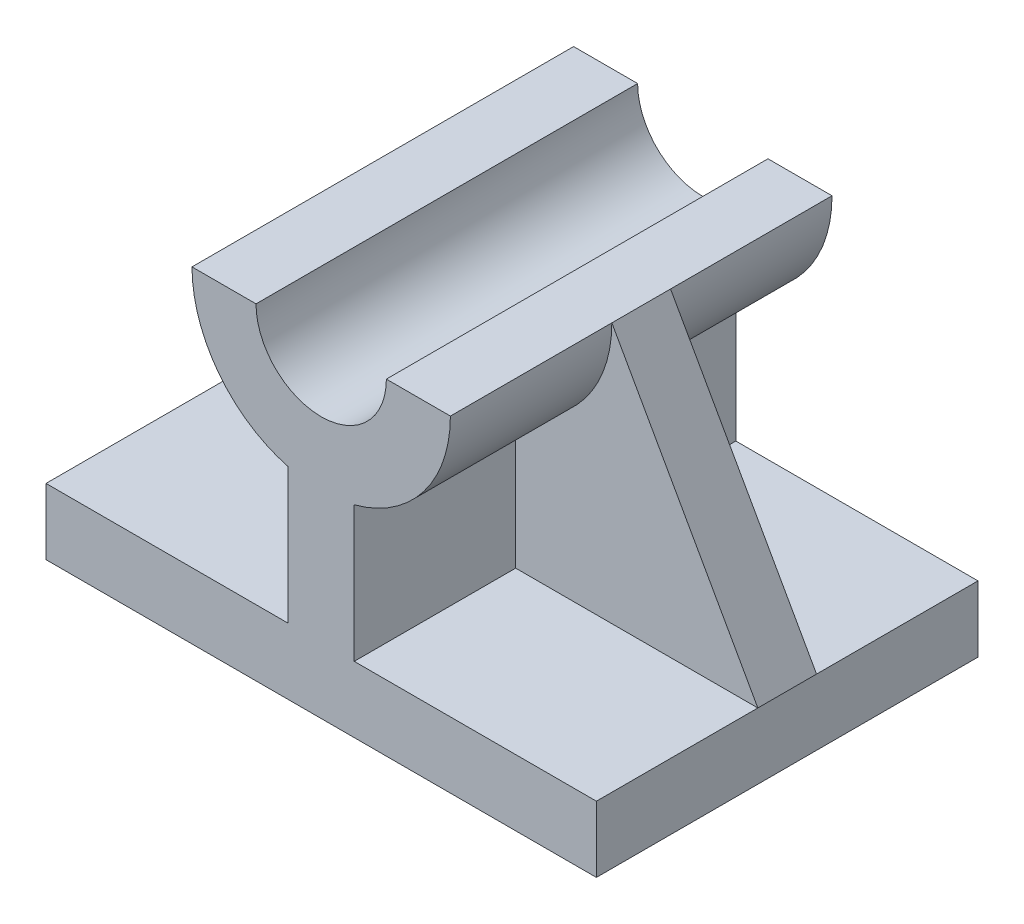
ISO-10303-21;
HEADER;
FILE_DESCRIPTION(('STEP AP214'),'2;1');
FILE_NAME('part.step','',(''),(''),'','','');
FILE_SCHEMA(('AUTOMOTIVE_DESIGN { 1 0 10303 214 1 1 1 1 }'));
ENDSEC;
DATA;
#1=APPLICATION_CONTEXT('core data for automotive mechanical design processes');
#2=APPLICATION_PROTOCOL_DEFINITION('international standard','automotive_design',2000,#1);
#3=PRODUCT_CONTEXT('',#1,'mechanical');
#4=PRODUCT('Part','Part','',(#3));
#5=PRODUCT_RELATED_PRODUCT_CATEGORY('part','',(#4));
#6=PRODUCT_DEFINITION_FORMATION('','',#4);
#7=PRODUCT_DEFINITION_CONTEXT('part definition',#1,'design');
#8=PRODUCT_DEFINITION('design','',#6,#7);
#9=PRODUCT_DEFINITION_SHAPE('','',#8);
#10=(LENGTH_UNIT() NAMED_UNIT(*) SI_UNIT(.MILLI.,.METRE.));
#11=(NAMED_UNIT(*) PLANE_ANGLE_UNIT() SI_UNIT($,.RADIAN.));
#12=(NAMED_UNIT(*) SI_UNIT($,.STERADIAN.) SOLID_ANGLE_UNIT());
#13=UNCERTAINTY_MEASURE_WITH_UNIT(LENGTH_MEASURE(1.E-05),#10,'distance_accuracy_value','');
#14=(GEOMETRIC_REPRESENTATION_CONTEXT(3) GLOBAL_UNCERTAINTY_ASSIGNED_CONTEXT((#13)) GLOBAL_UNIT_ASSIGNED_CONTEXT((#10,
#11,#12)) REPRESENTATION_CONTEXT('',''));
#15=CARTESIAN_POINT('',(0.,0.,0.));
#16=DIRECTION('',(0.,0.,1.));
#17=DIRECTION('',(1.,0.,0.));
#18=AXIS2_PLACEMENT_3D('',#15,#16,#17);
#19=CARTESIAN_POINT('',(0.,40.,-26.));
#20=DIRECTION('',(0.,0.,1.));
#21=DIRECTION('',(1.,0.,0.));
#22=AXIS2_PLACEMENT_3D('',#19,#20,#21);
#23=CYLINDRICAL_SURFACE('',#22,17.6059098801234);
#24=DIRECTION('',(0.,0.,1.));
#25=VECTOR('',#24,1.);
#26=CARTESIAN_POINT('',(17.6059098801234,40.,-26.));
#27=LINE('',#26,#25);
#28=CARTESIAN_POINT('',(17.6059098801234,40.,-26.));
#29=VERTEX_POINT('',#28);
#30=CARTESIAN_POINT('',(17.6059098801234,40.,-4.));
#31=VERTEX_POINT('',#30);
#32=EDGE_CURVE('E168',#29,#31,#27,.T.);
#33=ORIENTED_EDGE('',*,*,#32,.T.);
#34=CARTESIAN_POINT('',(0.,40.,-4.));
#35=DIRECTION('',(0.,0.,1.));
#36=DIRECTION('',(1.,0.,0.));
#37=AXIS2_PLACEMENT_3D('',#34,#35,#36);
#38=CIRCLE('',#37,17.6059098801234);
#39=CARTESIAN_POINT('',(4.5,22.9788936109598,-4.));
#40=VERTEX_POINT('',#39);
#41=EDGE_CURVE('E144',#31,#40,#38,.F.);
#42=ORIENTED_EDGE('',*,*,#41,.T.);
#43=DIRECTION('',(0.,0.,1.));
#44=VECTOR('',#43,1.);
#45=CARTESIAN_POINT('',(4.49999999999999,22.9788936109598,-26.));
#46=LINE('',#45,#44);
#47=CARTESIAN_POINT('',(4.49999999999999,22.9788936109598,-26.));
#48=VERTEX_POINT('',#47);
#49=EDGE_CURVE('E182',#48,#40,#46,.T.);
#50=ORIENTED_EDGE('',*,*,#49,.F.);
#51=CARTESIAN_POINT('',(0.,40.,-26.));
#52=DIRECTION('',(0.,0.,1.));
#53=DIRECTION('',(1.,0.,0.));
#54=AXIS2_PLACEMENT_3D('',#51,#52,#53);
#55=CIRCLE('',#54,17.6059098801234);
#56=EDGE_CURVE('E177',#48,#29,#55,.T.);
#57=ORIENTED_EDGE('',*,*,#56,.T.);
#58=EDGE_LOOP('',(#33,#42,#50,#57));
#59=FACE_BOUND('',#58,.T.);
#60=ADVANCED_FACE('F33',(#59),#23,.T.);
#61=CARTESIAN_POINT('',(4.5,22.9788936109598,-26.));
#62=DIRECTION('',(1.,0.,0.));
#63=DIRECTION('',(0.,0.,-1.));
#64=AXIS2_PLACEMENT_3D('',#61,#62,#63);
#65=PLANE('',#64);
#66=ORIENTED_EDGE('',*,*,#49,.T.);
#67=DIRECTION('',(0.,-1.,0.));
#68=VECTOR('',#67,1.);
#69=CARTESIAN_POINT('',(4.5,22.9788936109598,-4.));
#70=LINE('',#69,#68);
#71=CARTESIAN_POINT('',(4.5,4.5,-4.));
#72=VERTEX_POINT('',#71);
#73=EDGE_CURVE('E147',#40,#72,#70,.T.);
#74=ORIENTED_EDGE('',*,*,#73,.T.);
#75=DIRECTION('',(0.,0.,1.));
#76=VECTOR('',#75,1.);
#77=CARTESIAN_POINT('',(4.5,4.5,-26.));
#78=LINE('',#77,#76);
#79=CARTESIAN_POINT('',(4.5,4.5,-26.));
#80=VERTEX_POINT('',#79);
#81=EDGE_CURVE('E187',#80,#72,#78,.T.);
#82=ORIENTED_EDGE('',*,*,#81,.F.);
#83=DIRECTION('',(0.,1.,0.));
#84=VECTOR('',#83,1.);
#85=CARTESIAN_POINT('',(4.5,22.9788936109598,-26.));
#86=LINE('',#85,#84);
#87=EDGE_CURVE('E258',#80,#48,#86,.T.);
#88=ORIENTED_EDGE('',*,*,#87,.T.);
#89=EDGE_LOOP('',(#66,#74,#82,#88));
#90=FACE_BOUND('',#89,.T.);
#91=ADVANCED_FACE('F288',(#90),#65,.T.);
#92=CARTESIAN_POINT('',(4.5,4.5,-26.));
#93=DIRECTION('',(0.,1.,0.));
#94=DIRECTION('',(-1.,0.,0.));
#95=AXIS2_PLACEMENT_3D('',#92,#93,#94);
#96=PLANE('',#95);
#97=ORIENTED_EDGE('',*,*,#81,.T.);
#98=DIRECTION('',(1.,0.,0.));
#99=VECTOR('',#98,1.);
#100=CARTESIAN_POINT('',(4.5,4.5,-4.));
#101=LINE('',#100,#99);
#102=CARTESIAN_POINT('',(37.5,4.5,-4.00000000000001));
#103=VERTEX_POINT('',#102);
#104=EDGE_CURVE('E41',#72,#103,#101,.T.);
#105=ORIENTED_EDGE('',*,*,#104,.T.);
#106=DIRECTION('',(0.,0.,1.));
#107=VECTOR('',#106,1.);
#108=CARTESIAN_POINT('',(37.5,4.5,-26.));
#109=LINE('',#108,#107);
#110=CARTESIAN_POINT('',(37.5,4.5,-26.));
#111=VERTEX_POINT('',#110);
#112=EDGE_CURVE('E191',#111,#103,#109,.T.);
#113=ORIENTED_EDGE('',*,*,#112,.F.);
#114=DIRECTION('',(-1.,0.,0.));
#115=VECTOR('',#114,1.);
#116=CARTESIAN_POINT('',(4.5,4.5,-26.));
#117=LINE('',#116,#115);
#118=EDGE_CURVE('E255',#111,#80,#117,.T.);
#119=ORIENTED_EDGE('',*,*,#118,.T.);
#120=EDGE_LOOP('',(#97,#105,#113,#119));
#121=FACE_BOUND('',#120,.T.);
#122=ADVANCED_FACE('F283',(#121),#96,.T.);
#123=CARTESIAN_POINT('',(37.5,4.5,-26.));
#124=DIRECTION('',(1.,0.,0.));
#125=DIRECTION('',(0.,0.,-1.));
#126=AXIS2_PLACEMENT_3D('',#123,#124,#125);
#127=PLANE('',#126);
#128=DIRECTION('',(0.,1.,0.));
#129=VECTOR('',#128,1.);
#130=CARTESIAN_POINT('',(37.5,4.5,26.));
#131=LINE('',#130,#129);
#132=CARTESIAN_POINT('',(37.5,-4.5,26.));
#133=VERTEX_POINT('',#132);
#134=CARTESIAN_POINT('',(37.5,4.5,26.));
#135=VERTEX_POINT('',#134);
#136=EDGE_CURVE('E172',#133,#135,#131,.T.);
#137=ORIENTED_EDGE('',*,*,#136,.F.);
#138=DIRECTION('',(0.,0.,1.));
#139=VECTOR('',#138,1.);
#140=CARTESIAN_POINT('',(37.5,-4.5,-26.));
#141=LINE('',#140,#139);
#142=CARTESIAN_POINT('',(37.5,-4.5,-26.));
#143=VERTEX_POINT('',#142);
#144=EDGE_CURVE('E56',#143,#133,#141,.T.);
#145=ORIENTED_EDGE('',*,*,#144,.F.);
#146=DIRECTION('',(0.,1.,0.));
#147=VECTOR('',#146,1.);
#148=CARTESIAN_POINT('',(37.5,4.5,-26.));
#149=LINE('',#148,#147);
#150=EDGE_CURVE('E253',#143,#111,#149,.T.);
#151=ORIENTED_EDGE('',*,*,#150,.T.);
#152=ORIENTED_EDGE('',*,*,#112,.T.);
#153=CARTESIAN_POINT('',(37.5,4.5,4.));
#154=VERTEX_POINT('',#153);
#155=EDGE_CURVE('E160',#103,#154,#109,.T.);
#156=ORIENTED_EDGE('',*,*,#155,.T.);
#157=EDGE_CURVE('E193',#154,#135,#109,.T.);
#158=ORIENTED_EDGE('',*,*,#157,.T.);
#159=EDGE_LOOP('',(#137,#145,#151,#152,#156,#158));
#160=FACE_BOUND('',#159,.T.);
#161=ADVANCED_FACE('F35',(#160),#127,.T.);
#162=CARTESIAN_POINT('',(-37.5,-4.5,-26.));
#163=DIRECTION('',(0.,-1.,0.));
#164=DIRECTION('',(0.,0.,-1.));
#165=AXIS2_PLACEMENT_3D('',#162,#163,#164);
#166=PLANE('',#165);
#167=DIRECTION('',(1.,0.,0.));
#168=VECTOR('',#167,1.);
#169=CARTESIAN_POINT('',(-37.5,-4.5,26.));
#170=LINE('',#169,#168);
#171=CARTESIAN_POINT('',(-37.5,-4.5,26.));
#172=VERTEX_POINT('',#171);
#173=EDGE_CURVE('E251',#172,#133,#170,.T.);
#174=ORIENTED_EDGE('',*,*,#173,.F.);
#175=DIRECTION('',(0.,0.,1.));
#176=VECTOR('',#175,1.);
#177=CARTESIAN_POINT('',(-37.5,-4.5,-26.));
#178=LINE('',#177,#176);
#179=CARTESIAN_POINT('',(-37.5,-4.5,-26.));
#180=VERTEX_POINT('',#179);
#181=EDGE_CURVE('E195',#180,#172,#178,.T.);
#182=ORIENTED_EDGE('',*,*,#181,.F.);
#183=DIRECTION('',(1.,0.,0.));
#184=VECTOR('',#183,1.);
#185=CARTESIAN_POINT('',(-37.5,-4.5,-26.));
#186=LINE('',#185,#184);
#187=EDGE_CURVE('E204',#180,#143,#186,.T.);
#188=ORIENTED_EDGE('',*,*,#187,.T.);
#189=ORIENTED_EDGE('',*,*,#144,.T.);
#190=EDGE_LOOP('',(#174,#182,#188,#189));
#191=FACE_BOUND('',#190,.T.);
#192=ADVANCED_FACE('F319',(#191),#166,.T.);
#193=CARTESIAN_POINT('',(-37.5,4.5,-26.));
#194=DIRECTION('',(-1.,0.,0.));
#195=DIRECTION('',(0.,0.,1.));
#196=AXIS2_PLACEMENT_3D('',#193,#194,#195);
#197=PLANE('',#196);
#198=DIRECTION('',(0.,-1.,0.));
#199=VECTOR('',#198,1.);
#200=CARTESIAN_POINT('',(-37.5,4.5,26.));
#201=LINE('',#200,#199);
#202=CARTESIAN_POINT('',(-37.5,4.5,26.));
#203=VERTEX_POINT('',#202);
#204=EDGE_CURVE('E248',#203,#172,#201,.T.);
#205=ORIENTED_EDGE('',*,*,#204,.F.);
#206=DIRECTION('',(0.,0.,1.));
#207=VECTOR('',#206,1.);
#208=CARTESIAN_POINT('',(-37.5,4.5,-26.));
#209=LINE('',#208,#207);
#210=CARTESIAN_POINT('',(-37.5,4.5,-26.));
#211=VERTEX_POINT('',#210);
#212=EDGE_CURVE('E201',#211,#203,#209,.T.);
#213=ORIENTED_EDGE('',*,*,#212,.F.);
#214=DIRECTION('',(0.,-1.,0.));
#215=VECTOR('',#214,1.);
#216=CARTESIAN_POINT('',(-37.5,4.5,-26.));
#217=LINE('',#216,#215);
#218=EDGE_CURVE('E275',#211,#180,#217,.T.);
#219=ORIENTED_EDGE('',*,*,#218,.T.);
#220=ORIENTED_EDGE('',*,*,#181,.T.);
#221=EDGE_LOOP('',(#205,#213,#219,#220));
#222=FACE_BOUND('',#221,.T.);
#223=ADVANCED_FACE('F318',(#222),#197,.T.);
#224=CARTESIAN_POINT('',(-37.5,4.5,-26.));
#225=DIRECTION('',(0.,1.,0.));
#226=DIRECTION('',(-1.,0.,0.));
#227=AXIS2_PLACEMENT_3D('',#224,#225,#226);
#228=PLANE('',#227);
#229=DIRECTION('',(-1.,0.,0.));
#230=VECTOR('',#229,1.);
#231=CARTESIAN_POINT('',(-37.5,4.5,26.));
#232=LINE('',#231,#230);
#233=CARTESIAN_POINT('',(-4.5,4.5,26.));
#234=VERTEX_POINT('',#233);
#235=EDGE_CURVE('E245',#234,#203,#232,.T.);
#236=ORIENTED_EDGE('',*,*,#235,.F.);
#237=DIRECTION('',(0.,0.,1.));
#238=VECTOR('',#237,1.);
#239=CARTESIAN_POINT('',(-4.5,4.5,-26.));
#240=LINE('',#239,#238);
#241=CARTESIAN_POINT('',(-4.5,4.5,-26.));
#242=VERTEX_POINT('',#241);
#243=EDGE_CURVE('E208',#242,#234,#240,.T.);
#244=ORIENTED_EDGE('',*,*,#243,.F.);
#245=DIRECTION('',(-1.,0.,0.));
#246=VECTOR('',#245,1.);
#247=CARTESIAN_POINT('',(-37.5,4.5,-26.));
#248=LINE('',#247,#246);
#249=EDGE_CURVE('E273',#242,#211,#248,.T.);
#250=ORIENTED_EDGE('',*,*,#249,.T.);
#251=ORIENTED_EDGE('',*,*,#212,.T.);
#252=EDGE_LOOP('',(#236,#244,#250,#251));
#253=FACE_BOUND('',#252,.T.);
#254=ADVANCED_FACE('F316',(#253),#228,.T.);
#255=CARTESIAN_POINT('',(-4.5,22.9788936109598,-26.));
#256=DIRECTION('',(-1.,0.,0.));
#257=DIRECTION('',(0.,0.,1.));
#258=AXIS2_PLACEMENT_3D('',#255,#256,#257);
#259=PLANE('',#258);
#260=DIRECTION('',(0.,-1.,0.));
#261=VECTOR('',#260,1.);
#262=CARTESIAN_POINT('',(-4.5,22.9788936109598,26.));
#263=LINE('',#262,#261);
#264=CARTESIAN_POINT('',(-4.5,22.9788936109598,26.));
#265=VERTEX_POINT('',#264);
#266=EDGE_CURVE('E239',#265,#234,#263,.T.);
#267=ORIENTED_EDGE('',*,*,#266,.F.);
#268=DIRECTION('',(0.,0.,1.));
#269=VECTOR('',#268,1.);
#270=CARTESIAN_POINT('',(-4.5,22.9788936109598,-26.));
#271=LINE('',#270,#269);
#272=CARTESIAN_POINT('',(-4.5,22.9788936109598,-26.));
#273=VERTEX_POINT('',#272);
#274=EDGE_CURVE('E210',#273,#265,#271,.T.);
#275=ORIENTED_EDGE('',*,*,#274,.F.);
#276=DIRECTION('',(0.,-1.,0.));
#277=VECTOR('',#276,1.);
#278=CARTESIAN_POINT('',(-4.5,22.9788936109598,-26.));
#279=LINE('',#278,#277);
#280=EDGE_CURVE('E270',#273,#242,#279,.T.);
#281=ORIENTED_EDGE('',*,*,#280,.T.);
#282=ORIENTED_EDGE('',*,*,#243,.T.);
#283=EDGE_LOOP('',(#267,#275,#281,#282));
#284=FACE_BOUND('',#283,.T.);
#285=ADVANCED_FACE('F314',(#284),#259,.T.);
#286=CARTESIAN_POINT('',(0.,40.,-26.));
#287=DIRECTION('',(0.,0.,1.));
#288=DIRECTION('',(1.,0.,0.));
#289=AXIS2_PLACEMENT_3D('',#286,#287,#288);
#290=CYLINDRICAL_SURFACE('',#289,17.6059098801234);
#291=CARTESIAN_POINT('',(0.,40.,26.));
#292=DIRECTION('',(0.,0.,1.));
#293=DIRECTION('',(1.,0.,0.));
#294=AXIS2_PLACEMENT_3D('',#291,#292,#293);
#295=CIRCLE('',#294,17.6059098801234);
#296=CARTESIAN_POINT('',(-17.6059098801234,40.,26.));
#297=VERTEX_POINT('',#296);
#298=EDGE_CURVE('E237',#297,#265,#295,.T.);
#299=ORIENTED_EDGE('',*,*,#298,.F.);
#300=DIRECTION('',(0.,0.,1.));
#301=VECTOR('',#300,1.);
#302=CARTESIAN_POINT('',(-17.6059098801234,40.,-26.));
#303=LINE('',#302,#301);
#304=CARTESIAN_POINT('',(-17.6059098801234,40.,-26.));
#305=VERTEX_POINT('',#304);
#306=EDGE_CURVE('E212',#305,#297,#303,.T.);
#307=ORIENTED_EDGE('',*,*,#306,.F.);
#308=CARTESIAN_POINT('',(0.,40.,-26.));
#309=DIRECTION('',(0.,0.,1.));
#310=DIRECTION('',(1.,0.,0.));
#311=AXIS2_PLACEMENT_3D('',#308,#309,#310);
#312=CIRCLE('',#311,17.6059098801234);
#313=EDGE_CURVE('E267',#305,#273,#312,.T.);
#314=ORIENTED_EDGE('',*,*,#313,.T.);
#315=ORIENTED_EDGE('',*,*,#274,.T.);
#316=EDGE_LOOP('',(#299,#307,#314,#315));
#317=FACE_BOUND('',#316,.T.);
#318=ADVANCED_FACE('F310',(#317),#290,.T.);
#319=CARTESIAN_POINT('',(-17.6059098801234,40.,-26.));
#320=DIRECTION('',(0.,1.,0.));
#321=DIRECTION('',(0.,0.,1.));
#322=AXIS2_PLACEMENT_3D('',#319,#320,#321);
#323=PLANE('',#322);
#324=DIRECTION('',(-1.,0.,0.));
#325=VECTOR('',#324,1.);
#326=CARTESIAN_POINT('',(-17.6059098801234,40.,26.));
#327=LINE('',#326,#325);
#328=CARTESIAN_POINT('',(-8.88077593618405,40.,26.));
#329=VERTEX_POINT('',#328);
#330=EDGE_CURVE('E231',#329,#297,#327,.T.);
#331=ORIENTED_EDGE('',*,*,#330,.F.);
#332=DIRECTION('',(0.,0.,1.));
#333=VECTOR('',#332,1.);
#334=CARTESIAN_POINT('',(-8.88077593618405,40.,-26.));
#335=LINE('',#334,#333);
#336=CARTESIAN_POINT('',(-8.88077593618405,40.,-26.));
#337=VERTEX_POINT('',#336);
#338=EDGE_CURVE('E180',#337,#329,#335,.T.);
#339=ORIENTED_EDGE('',*,*,#338,.F.);
#340=DIRECTION('',(-1.,0.,0.));
#341=VECTOR('',#340,1.);
#342=CARTESIAN_POINT('',(-17.6059098801234,40.,-26.));
#343=LINE('',#342,#341);
#344=EDGE_CURVE('E265',#337,#305,#343,.T.);
#345=ORIENTED_EDGE('',*,*,#344,.T.);
#346=ORIENTED_EDGE('',*,*,#306,.T.);
#347=EDGE_LOOP('',(#331,#339,#345,#346));
#348=FACE_BOUND('',#347,.T.);
#349=ADVANCED_FACE('F236',(#348),#323,.T.);
#350=CARTESIAN_POINT('',(0.,40.,-26.));
#351=DIRECTION('',(0.,0.,1.));
#352=DIRECTION('',(1.,0.,0.));
#353=AXIS2_PLACEMENT_3D('',#350,#351,#352);
#354=CYLINDRICAL_SURFACE('',#353,8.88077593618405);
#355=CARTESIAN_POINT('',(0.,40.,26.));
#356=DIRECTION('',(0.,0.,-1.));
#357=DIRECTION('',(1.,0.,0.));
#358=AXIS2_PLACEMENT_3D('',#355,#356,#357);
#359=CIRCLE('',#358,8.88077593618405);
#360=CARTESIAN_POINT('',(8.88077593618405,40.,26.));
#361=VERTEX_POINT('',#360);
#362=EDGE_CURVE('E218',#361,#329,#359,.T.);
#363=ORIENTED_EDGE('',*,*,#362,.F.);
#364=DIRECTION('',(0.,0.,1.));
#365=VECTOR('',#364,1.);
#366=CARTESIAN_POINT('',(8.88077593618405,40.,-26.));
#367=LINE('',#366,#365);
#368=CARTESIAN_POINT('',(8.88077593618405,40.,-26.));
#369=VERTEX_POINT('',#368);
#370=EDGE_CURVE('E178',#369,#361,#367,.T.);
#371=ORIENTED_EDGE('',*,*,#370,.F.);
#372=CARTESIAN_POINT('',(0.,40.,-26.));
#373=DIRECTION('',(0.,0.,-1.));
#374=DIRECTION('',(1.,0.,0.));
#375=AXIS2_PLACEMENT_3D('',#372,#373,#374);
#376=CIRCLE('',#375,8.88077593618405);
#377=EDGE_CURVE('E220',#369,#337,#376,.T.);
#378=ORIENTED_EDGE('',*,*,#377,.T.);
#379=ORIENTED_EDGE('',*,*,#338,.T.);
#380=EDGE_LOOP('',(#363,#371,#378,#379));
#381=FACE_BOUND('',#380,.T.);
#382=ADVANCED_FACE('F217',(#381),#354,.F.);
#383=CARTESIAN_POINT('',(8.88077593618405,40.,-26.));
#384=DIRECTION('',(0.,1.,0.));
#385=DIRECTION('',(0.,0.,1.));
#386=AXIS2_PLACEMENT_3D('',#383,#384,#385);
#387=PLANE('',#386);
#388=CARTESIAN_POINT('',(17.6059098801234,40.,4.));
#389=VERTEX_POINT('',#388);
#390=CARTESIAN_POINT('',(17.6059098801234,40.,26.));
#391=VERTEX_POINT('',#390);
#392=EDGE_CURVE('E171',#389,#391,#27,.T.);
#393=ORIENTED_EDGE('',*,*,#392,.F.);
#394=DIRECTION('',(0.,0.,1.));
#395=VECTOR('',#394,1.);
#396=CARTESIAN_POINT('',(17.6059098801234,40.,-26.));
#397=LINE('',#396,#395);
#398=EDGE_CURVE('E157',#31,#389,#397,.T.);
#399=ORIENTED_EDGE('',*,*,#398,.F.);
#400=ORIENTED_EDGE('',*,*,#32,.F.);
#401=DIRECTION('',(-1.,0.,0.));
#402=VECTOR('',#401,1.);
#403=CARTESIAN_POINT('',(8.88077593618405,40.,-26.));
#404=LINE('',#403,#402);
#405=EDGE_CURVE('E262',#29,#369,#404,.T.);
#406=ORIENTED_EDGE('',*,*,#405,.T.);
#407=ORIENTED_EDGE('',*,*,#370,.T.);
#408=DIRECTION('',(-1.,0.,0.));
#409=VECTOR('',#408,1.);
#410=CARTESIAN_POINT('',(8.88077593618405,40.,26.));
#411=LINE('',#410,#409);
#412=EDGE_CURVE('E234',#391,#361,#411,.T.);
#413=ORIENTED_EDGE('',*,*,#412,.F.);
#414=EDGE_LOOP('',(#393,#399,#400,#406,#407,#413));
#415=FACE_BOUND('',#414,.T.);
#416=ADVANCED_FACE('F166',(#415),#387,.T.);
#417=CARTESIAN_POINT('',(0.,40.,4.));
#418=DIRECTION('',(0.,0.,1.));
#419=DIRECTION('',(1.,0.,0.));
#420=AXIS2_PLACEMENT_3D('',#417,#418,#419);
#421=CIRCLE('',#420,17.6059098801234);
#422=CARTESIAN_POINT('',(4.5,22.9788936109598,4.));
#423=VERTEX_POINT('',#422);
#424=EDGE_CURVE('E173',#389,#423,#421,.F.);
#425=ORIENTED_EDGE('',*,*,#424,.F.);
#426=ORIENTED_EDGE('',*,*,#392,.T.);
#427=CARTESIAN_POINT('',(0.,40.,26.));
#428=DIRECTION('',(0.,0.,1.));
#429=DIRECTION('',(1.,0.,0.));
#430=AXIS2_PLACEMENT_3D('',#427,#428,#429);
#431=CIRCLE('',#430,17.6059098801234);
#432=CARTESIAN_POINT('',(4.49999999999999,22.9788936109598,26.));
#433=VERTEX_POINT('',#432);
#434=EDGE_CURVE('E301',#433,#391,#431,.T.);
#435=ORIENTED_EDGE('',*,*,#434,.F.);
#436=EDGE_CURVE('E186',#423,#433,#46,.T.);
#437=ORIENTED_EDGE('',*,*,#436,.F.);
#438=EDGE_LOOP('',(#425,#426,#435,#437));
#439=FACE_BOUND('',#438,.T.);
#440=ADVANCED_FACE('F326',(#439),#23,.T.);
#441=DIRECTION('',(0.,-1.,0.));
#442=VECTOR('',#441,1.);
#443=CARTESIAN_POINT('',(4.5,22.9788936109598,4.));
#444=LINE('',#443,#442);
#445=CARTESIAN_POINT('',(4.5,4.5,4.));
#446=VERTEX_POINT('',#445);
#447=EDGE_CURVE('E151',#423,#446,#444,.T.);
#448=ORIENTED_EDGE('',*,*,#447,.F.);
#449=ORIENTED_EDGE('',*,*,#436,.T.);
#450=DIRECTION('',(0.,1.,0.));
#451=VECTOR('',#450,1.);
#452=CARTESIAN_POINT('',(4.5,22.9788936109598,26.));
#453=LINE('',#452,#451);
#454=CARTESIAN_POINT('',(4.5,4.5,26.));
#455=VERTEX_POINT('',#454);
#456=EDGE_CURVE('E298',#455,#433,#453,.T.);
#457=ORIENTED_EDGE('',*,*,#456,.F.);
#458=EDGE_CURVE('E190',#446,#455,#78,.T.);
#459=ORIENTED_EDGE('',*,*,#458,.F.);
#460=EDGE_LOOP('',(#448,#449,#457,#459));
#461=FACE_BOUND('',#460,.T.);
#462=ADVANCED_FACE('F324',(#461),#65,.T.);
#463=DIRECTION('',(1.,0.,0.));
#464=VECTOR('',#463,1.);
#465=CARTESIAN_POINT('',(4.5,4.5,4.));
#466=LINE('',#465,#464);
#467=EDGE_CURVE('E11',#446,#154,#466,.T.);
#468=ORIENTED_EDGE('',*,*,#467,.F.);
#469=ORIENTED_EDGE('',*,*,#458,.T.);
#470=DIRECTION('',(-1.,0.,0.));
#471=VECTOR('',#470,1.);
#472=CARTESIAN_POINT('',(4.5,4.5,26.));
#473=LINE('',#472,#471);
#474=EDGE_CURVE('E295',#135,#455,#473,.T.);
#475=ORIENTED_EDGE('',*,*,#474,.F.);
#476=ORIENTED_EDGE('',*,*,#157,.F.);
#477=EDGE_LOOP('',(#468,#469,#475,#476));
#478=FACE_BOUND('',#477,.T.);
#479=ADVANCED_FACE('F330',(#478),#96,.T.);
#480=CARTESIAN_POINT('',(0.,40.,-26.));
#481=DIRECTION('',(0.,0.,1.));
#482=DIRECTION('',(1.,0.,0.));
#483=AXIS2_PLACEMENT_3D('',#480,#481,#482);
#484=PLANE('',#483);
#485=ORIENTED_EDGE('',*,*,#150,.F.);
#486=ORIENTED_EDGE('',*,*,#187,.F.);
#487=ORIENTED_EDGE('',*,*,#218,.F.);
#488=ORIENTED_EDGE('',*,*,#249,.F.);
#489=ORIENTED_EDGE('',*,*,#280,.F.);
#490=ORIENTED_EDGE('',*,*,#313,.F.);
#491=ORIENTED_EDGE('',*,*,#344,.F.);
#492=ORIENTED_EDGE('',*,*,#377,.F.);
#493=ORIENTED_EDGE('',*,*,#405,.F.);
#494=ORIENTED_EDGE('',*,*,#56,.F.);
#495=ORIENTED_EDGE('',*,*,#87,.F.);
#496=ORIENTED_EDGE('',*,*,#118,.F.);
#497=EDGE_LOOP('',(#485,#486,#487,#488,#489,#490,#491,#492,#493,#494,#495,#496));
#498=FACE_BOUND('',#497,.T.);
#499=ADVANCED_FACE('F286',(#498),#484,.F.);
#500=CARTESIAN_POINT('',(0.,40.,26.));
#501=DIRECTION('',(0.,0.,1.));
#502=DIRECTION('',(1.,0.,0.));
#503=AXIS2_PLACEMENT_3D('',#500,#501,#502);
#504=PLANE('',#503);
#505=ORIENTED_EDGE('',*,*,#136,.T.);
#506=ORIENTED_EDGE('',*,*,#474,.T.);
#507=ORIENTED_EDGE('',*,*,#456,.T.);
#508=ORIENTED_EDGE('',*,*,#434,.T.);
#509=ORIENTED_EDGE('',*,*,#412,.T.);
#510=ORIENTED_EDGE('',*,*,#362,.T.);
#511=ORIENTED_EDGE('',*,*,#330,.T.);
#512=ORIENTED_EDGE('',*,*,#298,.T.);
#513=ORIENTED_EDGE('',*,*,#266,.T.);
#514=ORIENTED_EDGE('',*,*,#235,.T.);
#515=ORIENTED_EDGE('',*,*,#204,.T.);
#516=ORIENTED_EDGE('',*,*,#173,.T.);
#517=EDGE_LOOP('',(#505,#506,#507,#508,#509,#510,#511,#512,#513,#514,#515,#516));
#518=FACE_BOUND('',#517,.T.);
#519=ADVANCED_FACE('F229',(#518),#504,.T.);
#520=CARTESIAN_POINT('',(17.6059098801234,40.,0.));
#521=DIRECTION('',(-0.872358369407219,-0.488866930079319,0.));
#522=DIRECTION('',(0.488866930079319,-0.872358369407219,0.));
#523=AXIS2_PLACEMENT_3D('',#520,#521,#522);
#524=PLANE('',#523);
#525=DIRECTION('',(0.488866930079319,-0.872358369407219,0.));
#526=VECTOR('',#525,1.);
#527=CARTESIAN_POINT('',(17.6059098801234,40.,-4.));
#528=LINE('',#527,#526);
#529=EDGE_CURVE('E48',#31,#103,#528,.T.);
#530=ORIENTED_EDGE('',*,*,#529,.F.);
#531=ORIENTED_EDGE('',*,*,#398,.T.);
#532=DIRECTION('',(0.488866930079319,-0.872358369407219,0.));
#533=VECTOR('',#532,1.);
#534=CARTESIAN_POINT('',(17.6059098801234,40.,4.));
#535=LINE('',#534,#533);
#536=EDGE_CURVE('E162',#389,#154,#535,.T.);
#537=ORIENTED_EDGE('',*,*,#536,.T.);
#538=ORIENTED_EDGE('',*,*,#155,.F.);
#539=EDGE_LOOP('',(#530,#531,#537,#538));
#540=FACE_BOUND('',#539,.T.);
#541=ADVANCED_FACE('F155',(#540),#524,.F.);
#542=CARTESIAN_POINT('',(0.,17.75,4.));
#543=DIRECTION('',(0.,0.,1.));
#544=DIRECTION('',(1.,0.,0.));
#545=AXIS2_PLACEMENT_3D('',#542,#543,#544);
#546=PLANE('',#545);
#547=ORIENTED_EDGE('',*,*,#536,.F.);
#548=ORIENTED_EDGE('',*,*,#424,.T.);
#549=ORIENTED_EDGE('',*,*,#447,.T.);
#550=ORIENTED_EDGE('',*,*,#467,.T.);
#551=EDGE_LOOP('',(#547,#548,#549,#550));
#552=FACE_BOUND('',#551,.T.);
#553=ADVANCED_FACE('F328',(#552),#546,.T.);
#554=CARTESIAN_POINT('',(0.,17.75,-4.));
#555=DIRECTION('',(0.,0.,1.));
#556=DIRECTION('',(1.,0.,0.));
#557=AXIS2_PLACEMENT_3D('',#554,#555,#556);
#558=PLANE('',#557);
#559=ORIENTED_EDGE('',*,*,#41,.F.);
#560=ORIENTED_EDGE('',*,*,#529,.T.);
#561=ORIENTED_EDGE('',*,*,#104,.F.);
#562=ORIENTED_EDGE('',*,*,#73,.F.);
#563=EDGE_LOOP('',(#559,#560,#561,#562));
#564=FACE_BOUND('',#563,.T.);
#565=ADVANCED_FACE('F145',(#564),#558,.F.);
#566=CLOSED_SHELL('',(#60,#91,#122,#161,#192,#223,#254,#285,#318,#349,#382,#416,#440,#462,#479,
#499,#519,#541,#553,#565));
#567=MANIFOLD_SOLID_BREP('B2',#566);
#568=ADVANCED_BREP_SHAPE_REPRESENTATION('',(#18,#567),#14);
#569=SHAPE_DEFINITION_REPRESENTATION(#9,#568);
ENDSEC;
END-ISO-10303-21;
